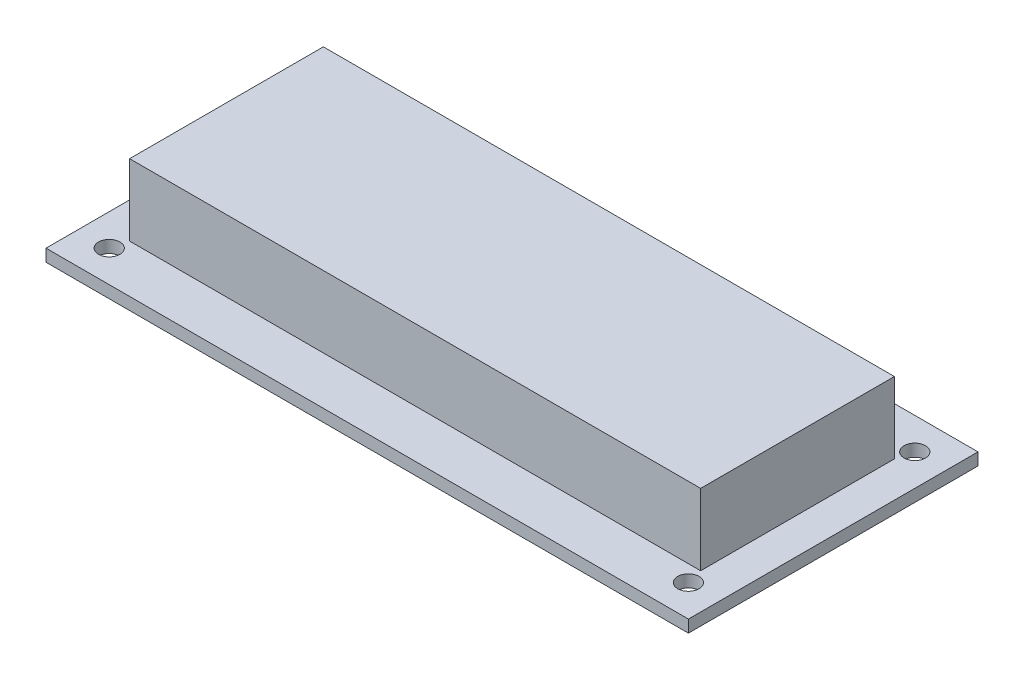
ISO-10303-21;
HEADER;
FILE_DESCRIPTION(('STEP AP214'),'2;1');
FILE_NAME('part.step','',(''),(''),'','','');
FILE_SCHEMA(('AUTOMOTIVE_DESIGN { 1 0 10303 214 1 1 1 1 }'));
ENDSEC;
DATA;
#1=APPLICATION_CONTEXT('core data for automotive mechanical design processes');
#2=APPLICATION_PROTOCOL_DEFINITION('international standard','automotive_design',2000,#1);
#3=PRODUCT_CONTEXT('',#1,'mechanical');
#4=PRODUCT('Part','Part','',(#3));
#5=PRODUCT_RELATED_PRODUCT_CATEGORY('part','',(#4));
#6=PRODUCT_DEFINITION_FORMATION('','',#4);
#7=PRODUCT_DEFINITION_CONTEXT('part definition',#1,'design');
#8=PRODUCT_DEFINITION('design','',#6,#7);
#9=PRODUCT_DEFINITION_SHAPE('','',#8);
#10=(LENGTH_UNIT() NAMED_UNIT(*) SI_UNIT(.MILLI.,.METRE.));
#11=(NAMED_UNIT(*) PLANE_ANGLE_UNIT() SI_UNIT($,.RADIAN.));
#12=(NAMED_UNIT(*) SI_UNIT($,.STERADIAN.) SOLID_ANGLE_UNIT());
#13=UNCERTAINTY_MEASURE_WITH_UNIT(LENGTH_MEASURE(1.E-05),#10,'distance_accuracy_value','');
#14=(GEOMETRIC_REPRESENTATION_CONTEXT(3) GLOBAL_UNCERTAINTY_ASSIGNED_CONTEXT((#13)) GLOBAL_UNIT_ASSIGNED_CONTEXT((#10,
#11,#12)) REPRESENTATION_CONTEXT('',''));
#15=CARTESIAN_POINT('',(0.,0.,0.));
#16=DIRECTION('',(0.,0.,1.));
#17=DIRECTION('',(1.,0.,0.));
#18=AXIS2_PLACEMENT_3D('',#15,#16,#17);
#19=CARTESIAN_POINT('',(0.,1.524,0.));
#20=DIRECTION('',(0.,1.,0.));
#21=DIRECTION('',(0.,0.,1.));
#22=AXIS2_PLACEMENT_3D('',#19,#20,#21);
#23=PLANE('',#22);
#24=CARTESIAN_POINT('',(-36.068,1.524,14.097));
#25=DIRECTION('',(0.,1.,0.));
#26=DIRECTION('',(0.,0.,1.));
#27=AXIS2_PLACEMENT_3D('',#24,#25,#26);
#28=CIRCLE('',#27,1.3335);
#29=CARTESIAN_POINT('',(-36.068,1.524,15.4305));
#30=VERTEX_POINT('',#29);
#31=EDGE_CURVE('E186',#30,#30,#28,.T.);
#32=ORIENTED_EDGE('',*,*,#31,.F.);
#33=EDGE_LOOP('',(#32));
#34=FACE_BOUND('',#33,.T.);
#35=CARTESIAN_POINT('',(36.068,1.524,14.097));
#36=DIRECTION('',(0.,1.,0.));
#37=DIRECTION('',(0.,0.,1.));
#38=AXIS2_PLACEMENT_3D('',#35,#36,#37);
#39=CIRCLE('',#38,1.3335);
#40=CARTESIAN_POINT('',(36.068,1.524,15.4305));
#41=VERTEX_POINT('',#40);
#42=EDGE_CURVE('E195',#41,#41,#39,.T.);
#43=ORIENTED_EDGE('',*,*,#42,.F.);
#44=EDGE_LOOP('',(#43));
#45=FACE_BOUND('',#44,.T.);
#46=CARTESIAN_POINT('',(36.068,1.524,-14.097));
#47=DIRECTION('',(0.,1.,0.));
#48=DIRECTION('',(0.,0.,1.));
#49=AXIS2_PLACEMENT_3D('',#46,#47,#48);
#50=CIRCLE('',#49,1.3335);
#51=CARTESIAN_POINT('',(36.068,1.524,-12.7635));
#52=VERTEX_POINT('',#51);
#53=EDGE_CURVE('E187',#52,#52,#50,.T.);
#54=ORIENTED_EDGE('',*,*,#53,.F.);
#55=EDGE_LOOP('',(#54));
#56=FACE_BOUND('',#55,.T.);
#57=CARTESIAN_POINT('',(-36.068,1.524,-14.097));
#58=DIRECTION('',(0.,1.,0.));
#59=DIRECTION('',(0.,0.,1.));
#60=AXIS2_PLACEMENT_3D('',#57,#58,#59);
#61=CIRCLE('',#60,1.3335);
#62=CARTESIAN_POINT('',(-36.068,1.524,-12.7635));
#63=VERTEX_POINT('',#62);
#64=EDGE_CURVE('E194',#63,#63,#61,.T.);
#65=ORIENTED_EDGE('',*,*,#64,.F.);
#66=EDGE_LOOP('',(#65));
#67=FACE_BOUND('',#66,.T.);
#68=DIRECTION('',(0.,0.,-1.));
#69=VECTOR('',#68,1.);
#70=CARTESIAN_POINT('',(40.005,1.524,-18.034));
#71=LINE('',#70,#69);
#72=CARTESIAN_POINT('',(40.005,1.524,18.034));
#73=VERTEX_POINT('',#72);
#74=CARTESIAN_POINT('',(40.005,1.524,-18.034));
#75=VERTEX_POINT('',#74);
#76=EDGE_CURVE('E211',#73,#75,#71,.T.);
#77=ORIENTED_EDGE('',*,*,#76,.T.);
#78=DIRECTION('',(-1.,0.,0.));
#79=VECTOR('',#78,1.);
#80=CARTESIAN_POINT('',(-40.005,1.524,-18.034));
#81=LINE('',#80,#79);
#82=CARTESIAN_POINT('',(-40.005,1.524,-18.034));
#83=VERTEX_POINT('',#82);
#84=EDGE_CURVE('E214',#75,#83,#81,.T.);
#85=ORIENTED_EDGE('',*,*,#84,.T.);
#86=DIRECTION('',(0.,0.,1.));
#87=VECTOR('',#86,1.);
#88=CARTESIAN_POINT('',(-40.005,1.524,-18.034));
#89=LINE('',#88,#87);
#90=CARTESIAN_POINT('',(-40.005,1.524,18.034));
#91=VERTEX_POINT('',#90);
#92=EDGE_CURVE('E217',#83,#91,#89,.T.);
#93=ORIENTED_EDGE('',*,*,#92,.T.);
#94=DIRECTION('',(1.,0.,0.));
#95=VECTOR('',#94,1.);
#96=CARTESIAN_POINT('',(-40.005,1.524,18.034));
#97=LINE('',#96,#95);
#98=EDGE_CURVE('E219',#91,#73,#97,.T.);
#99=ORIENTED_EDGE('',*,*,#98,.T.);
#100=EDGE_LOOP('',(#77,#85,#93,#99));
#101=FACE_BOUND('',#100,.T.);
#102=DIRECTION('',(0.,0.,1.));
#103=VECTOR('',#102,1.);
#104=CARTESIAN_POINT('',(-38.481,1.524,-9.0678));
#105=LINE('',#104,#103);
#106=CARTESIAN_POINT('',(-38.481,1.524,-9.0678));
#107=VERTEX_POINT('',#106);
#108=CARTESIAN_POINT('',(-38.481,1.524,9.017));
#109=VERTEX_POINT('',#108);
#110=EDGE_CURVE('E47',#107,#109,#105,.T.);
#111=ORIENTED_EDGE('',*,*,#110,.F.);
#112=DIRECTION('',(-1.,0.,0.));
#113=VECTOR('',#112,1.);
#114=CARTESIAN_POINT('',(-35.56,1.524,-9.0678));
#115=LINE('',#114,#113);
#116=CARTESIAN_POINT('',(-35.56,1.524,-9.0678));
#117=VERTEX_POINT('',#116);
#118=EDGE_CURVE('E151',#117,#107,#115,.T.);
#119=ORIENTED_EDGE('',*,*,#118,.F.);
#120=DIRECTION('',(0.,0.,1.));
#121=VECTOR('',#120,1.);
#122=CARTESIAN_POINT('',(-35.56,1.524,-12.065));
#123=LINE('',#122,#121);
#124=CARTESIAN_POINT('',(-35.56,1.524,-12.065));
#125=VERTEX_POINT('',#124);
#126=EDGE_CURVE('E128',#125,#117,#123,.T.);
#127=ORIENTED_EDGE('',*,*,#126,.F.);
#128=DIRECTION('',(-1.,0.,0.));
#129=VECTOR('',#128,1.);
#130=CARTESIAN_POINT('',(-35.56,1.524,-12.065));
#131=LINE('',#130,#129);
#132=CARTESIAN_POINT('',(35.56,1.524,-12.065));
#133=VERTEX_POINT('',#132);
#134=EDGE_CURVE('E172',#133,#125,#131,.T.);
#135=ORIENTED_EDGE('',*,*,#134,.F.);
#136=DIRECTION('',(0.,0.,-1.));
#137=VECTOR('',#136,1.);
#138=CARTESIAN_POINT('',(35.56,1.524,-12.065));
#139=LINE('',#138,#137);
#140=CARTESIAN_POINT('',(35.56,1.524,12.065));
#141=VERTEX_POINT('',#140);
#142=EDGE_CURVE('E130',#141,#133,#139,.T.);
#143=ORIENTED_EDGE('',*,*,#142,.F.);
#144=DIRECTION('',(1.,0.,0.));
#145=VECTOR('',#144,1.);
#146=CARTESIAN_POINT('',(-35.56,1.524,12.065));
#147=LINE('',#146,#145);
#148=CARTESIAN_POINT('',(-35.56,1.524,12.065));
#149=VERTEX_POINT('',#148);
#150=EDGE_CURVE('E163',#149,#141,#147,.T.);
#151=ORIENTED_EDGE('',*,*,#150,.F.);
#152=CARTESIAN_POINT('',(-35.56,1.524,9.01699999999999));
#153=VERTEX_POINT('',#152);
#154=EDGE_CURVE('E174',#153,#149,#123,.T.);
#155=ORIENTED_EDGE('',*,*,#154,.F.);
#156=DIRECTION('',(1.,0.,0.));
#157=VECTOR('',#156,1.);
#158=CARTESIAN_POINT('',(-35.56,1.524,9.017));
#159=LINE('',#158,#157);
#160=EDGE_CURVE('E52',#109,#153,#159,.T.);
#161=ORIENTED_EDGE('',*,*,#160,.F.);
#162=EDGE_LOOP('',(#111,#119,#127,#135,#143,#151,#155,#161));
#163=FACE_BOUND('',#162,.T.);
#164=ADVANCED_FACE('F32',(#34,#45,#56,#67,#101,#163),#23,.T.);
#165=CARTESIAN_POINT('',(-35.56,10.414,-12.065));
#166=DIRECTION('',(1.,0.,0.));
#167=DIRECTION('',(0.,0.,-1.));
#168=AXIS2_PLACEMENT_3D('',#165,#166,#167);
#169=PLANE('',#168);
#170=DIRECTION('',(0.,-1.,0.));
#171=VECTOR('',#170,1.);
#172=CARTESIAN_POINT('',(-35.56,4.699,-9.0678));
#173=LINE('',#172,#171);
#174=CARTESIAN_POINT('',(-35.56,4.699,-9.0678));
#175=VERTEX_POINT('',#174);
#176=EDGE_CURVE('E120',#175,#117,#173,.T.);
#177=ORIENTED_EDGE('',*,*,#176,.F.);
#178=DIRECTION('',(0.,0.,-1.));
#179=VECTOR('',#178,1.);
#180=CARTESIAN_POINT('',(-35.56,4.699,-9.0678));
#181=LINE('',#180,#179);
#182=CARTESIAN_POINT('',(-35.56,4.699,9.017));
#183=VERTEX_POINT('',#182);
#184=EDGE_CURVE('E124',#183,#175,#181,.T.);
#185=ORIENTED_EDGE('',*,*,#184,.F.);
#186=DIRECTION('',(0.,-1.,0.));
#187=VECTOR('',#186,1.);
#188=CARTESIAN_POINT('',(-35.56,4.699,9.017));
#189=LINE('',#188,#187);
#190=EDGE_CURVE('E150',#183,#153,#189,.T.);
#191=ORIENTED_EDGE('',*,*,#190,.T.);
#192=ORIENTED_EDGE('',*,*,#154,.T.);
#193=DIRECTION('',(0.,-1.,0.));
#194=VECTOR('',#193,1.);
#195=CARTESIAN_POINT('',(-35.56,10.414,12.065));
#196=LINE('',#195,#194);
#197=CARTESIAN_POINT('',(-35.56,10.414,12.065));
#198=VERTEX_POINT('',#197);
#199=EDGE_CURVE('E179',#198,#149,#196,.T.);
#200=ORIENTED_EDGE('',*,*,#199,.F.);
#201=DIRECTION('',(0.,0.,1.));
#202=VECTOR('',#201,1.);
#203=CARTESIAN_POINT('',(-35.56,10.414,-12.065));
#204=LINE('',#203,#202);
#205=CARTESIAN_POINT('',(-35.56,10.414,-12.065));
#206=VERTEX_POINT('',#205);
#207=EDGE_CURVE('E165',#206,#198,#204,.T.);
#208=ORIENTED_EDGE('',*,*,#207,.F.);
#209=DIRECTION('',(0.,-1.,0.));
#210=VECTOR('',#209,1.);
#211=CARTESIAN_POINT('',(-35.56,10.414,-12.065));
#212=LINE('',#211,#210);
#213=EDGE_CURVE('E182',#206,#125,#212,.T.);
#214=ORIENTED_EDGE('',*,*,#213,.T.);
#215=ORIENTED_EDGE('',*,*,#126,.T.);
#216=EDGE_LOOP('',(#177,#185,#191,#192,#200,#208,#214,#215));
#217=FACE_BOUND('',#216,.T.);
#218=ADVANCED_FACE('F122',(#217),#169,.F.);
#219=CARTESIAN_POINT('',(40.005,1.524,-18.034));
#220=DIRECTION('',(-1.,0.,0.));
#221=DIRECTION('',(0.,0.,1.));
#222=AXIS2_PLACEMENT_3D('',#219,#220,#221);
#223=PLANE('',#222);
#224=DIRECTION('',(0.,0.,-1.));
#225=VECTOR('',#224,1.);
#226=CARTESIAN_POINT('',(40.005,0.,-18.034));
#227=LINE('',#226,#225);
#228=CARTESIAN_POINT('',(40.005,0.,18.034));
#229=VERTEX_POINT('',#228);
#230=CARTESIAN_POINT('',(40.005,0.,-18.034));
#231=VERTEX_POINT('',#230);
#232=EDGE_CURVE('E210',#229,#231,#227,.T.);
#233=ORIENTED_EDGE('',*,*,#232,.T.);
#234=DIRECTION('',(0.,-1.,0.));
#235=VECTOR('',#234,1.);
#236=CARTESIAN_POINT('',(40.005,1.524,-18.034));
#237=LINE('',#236,#235);
#238=EDGE_CURVE('E11',#75,#231,#237,.T.);
#239=ORIENTED_EDGE('',*,*,#238,.F.);
#240=ORIENTED_EDGE('',*,*,#76,.F.);
#241=DIRECTION('',(0.,-1.,0.));
#242=VECTOR('',#241,1.);
#243=CARTESIAN_POINT('',(40.005,1.524,18.034));
#244=LINE('',#243,#242);
#245=EDGE_CURVE('E221',#73,#229,#244,.T.);
#246=ORIENTED_EDGE('',*,*,#245,.T.);
#247=EDGE_LOOP('',(#233,#239,#240,#246));
#248=FACE_BOUND('',#247,.T.);
#249=ADVANCED_FACE('F34',(#248),#223,.F.);
#250=CARTESIAN_POINT('',(-40.005,1.524,-18.034));
#251=DIRECTION('',(0.,0.,1.));
#252=DIRECTION('',(1.,0.,0.));
#253=AXIS2_PLACEMENT_3D('',#250,#251,#252);
#254=PLANE('',#253);
#255=DIRECTION('',(-1.,0.,0.));
#256=VECTOR('',#255,1.);
#257=CARTESIAN_POINT('',(-40.005,0.,-18.034));
#258=LINE('',#257,#256);
#259=CARTESIAN_POINT('',(-40.005,0.,-18.034));
#260=VERTEX_POINT('',#259);
#261=EDGE_CURVE('E224',#231,#260,#258,.T.);
#262=ORIENTED_EDGE('',*,*,#261,.T.);
#263=DIRECTION('',(0.,-1.,0.));
#264=VECTOR('',#263,1.);
#265=CARTESIAN_POINT('',(-40.005,1.524,-18.034));
#266=LINE('',#265,#264);
#267=EDGE_CURVE('E40',#83,#260,#266,.T.);
#268=ORIENTED_EDGE('',*,*,#267,.F.);
#269=ORIENTED_EDGE('',*,*,#84,.F.);
#270=ORIENTED_EDGE('',*,*,#238,.T.);
#271=EDGE_LOOP('',(#262,#268,#269,#270));
#272=FACE_BOUND('',#271,.T.);
#273=ADVANCED_FACE('F253',(#272),#254,.F.);
#274=CARTESIAN_POINT('',(-40.005,1.524,-18.034));
#275=DIRECTION('',(1.,0.,0.));
#276=DIRECTION('',(0.,0.,-1.));
#277=AXIS2_PLACEMENT_3D('',#274,#275,#276);
#278=PLANE('',#277);
#279=DIRECTION('',(0.,0.,1.));
#280=VECTOR('',#279,1.);
#281=CARTESIAN_POINT('',(-40.005,0.,-18.034));
#282=LINE('',#281,#280);
#283=CARTESIAN_POINT('',(-40.005,0.,18.034));
#284=VERTEX_POINT('',#283);
#285=EDGE_CURVE('E226',#260,#284,#282,.T.);
#286=ORIENTED_EDGE('',*,*,#285,.T.);
#287=DIRECTION('',(0.,-1.,0.));
#288=VECTOR('',#287,1.);
#289=CARTESIAN_POINT('',(-40.005,1.524,18.034));
#290=LINE('',#289,#288);
#291=EDGE_CURVE('E231',#91,#284,#290,.T.);
#292=ORIENTED_EDGE('',*,*,#291,.F.);
#293=ORIENTED_EDGE('',*,*,#92,.F.);
#294=ORIENTED_EDGE('',*,*,#267,.T.);
#295=EDGE_LOOP('',(#286,#292,#293,#294));
#296=FACE_BOUND('',#295,.T.);
#297=ADVANCED_FACE('F238',(#296),#278,.F.);
#298=CARTESIAN_POINT('',(-40.005,1.524,18.034));
#299=DIRECTION('',(0.,0.,-1.));
#300=DIRECTION('',(-1.,0.,0.));
#301=AXIS2_PLACEMENT_3D('',#298,#299,#300);
#302=PLANE('',#301);
#303=DIRECTION('',(1.,0.,0.));
#304=VECTOR('',#303,1.);
#305=CARTESIAN_POINT('',(-40.005,0.,18.034));
#306=LINE('',#305,#304);
#307=EDGE_CURVE('E215',#284,#229,#306,.T.);
#308=ORIENTED_EDGE('',*,*,#307,.T.);
#309=ORIENTED_EDGE('',*,*,#245,.F.);
#310=ORIENTED_EDGE('',*,*,#98,.F.);
#311=ORIENTED_EDGE('',*,*,#291,.T.);
#312=EDGE_LOOP('',(#308,#309,#310,#311));
#313=FACE_BOUND('',#312,.T.);
#314=ADVANCED_FACE('F247',(#313),#302,.F.);
#315=CARTESIAN_POINT('',(0.,0.,0.));
#316=DIRECTION('',(0.,1.,0.));
#317=DIRECTION('',(0.,0.,1.));
#318=AXIS2_PLACEMENT_3D('',#315,#316,#317);
#319=PLANE('',#318);
#320=CARTESIAN_POINT('',(-36.068,0.,14.097));
#321=DIRECTION('',(0.,1.,0.));
#322=DIRECTION('',(0.,0.,1.));
#323=AXIS2_PLACEMENT_3D('',#320,#321,#322);
#324=CIRCLE('',#323,1.3335);
#325=CARTESIAN_POINT('',(-36.068,0.,15.4305));
#326=VERTEX_POINT('',#325);
#327=EDGE_CURVE('E198',#326,#326,#324,.F.);
#328=ORIENTED_EDGE('',*,*,#327,.F.);
#329=EDGE_LOOP('',(#328));
#330=FACE_BOUND('',#329,.T.);
#331=CARTESIAN_POINT('',(36.068,0.,14.097));
#332=DIRECTION('',(0.,1.,0.));
#333=DIRECTION('',(0.,0.,1.));
#334=AXIS2_PLACEMENT_3D('',#331,#332,#333);
#335=CIRCLE('',#334,1.3335);
#336=CARTESIAN_POINT('',(36.068,0.,15.4305));
#337=VERTEX_POINT('',#336);
#338=EDGE_CURVE('E191',#337,#337,#335,.F.);
#339=ORIENTED_EDGE('',*,*,#338,.F.);
#340=EDGE_LOOP('',(#339));
#341=FACE_BOUND('',#340,.T.);
#342=CARTESIAN_POINT('',(36.068,0.,-14.097));
#343=DIRECTION('',(0.,1.,0.));
#344=DIRECTION('',(0.,0.,1.));
#345=AXIS2_PLACEMENT_3D('',#342,#343,#344);
#346=CIRCLE('',#345,1.3335);
#347=CARTESIAN_POINT('',(36.068,0.,-12.7635));
#348=VERTEX_POINT('',#347);
#349=EDGE_CURVE('E190',#348,#348,#346,.F.);
#350=ORIENTED_EDGE('',*,*,#349,.F.);
#351=EDGE_LOOP('',(#350));
#352=FACE_BOUND('',#351,.T.);
#353=CARTESIAN_POINT('',(-36.068,0.,-14.097));
#354=DIRECTION('',(0.,1.,0.));
#355=DIRECTION('',(0.,0.,1.));
#356=AXIS2_PLACEMENT_3D('',#353,#354,#355);
#357=CIRCLE('',#356,1.3335);
#358=CARTESIAN_POINT('',(-36.068,0.,-12.7635));
#359=VERTEX_POINT('',#358);
#360=EDGE_CURVE('E207',#359,#359,#357,.F.);
#361=ORIENTED_EDGE('',*,*,#360,.F.);
#362=EDGE_LOOP('',(#361));
#363=FACE_BOUND('',#362,.T.);
#364=ORIENTED_EDGE('',*,*,#232,.F.);
#365=ORIENTED_EDGE('',*,*,#307,.F.);
#366=ORIENTED_EDGE('',*,*,#285,.F.);
#367=ORIENTED_EDGE('',*,*,#261,.F.);
#368=EDGE_LOOP('',(#364,#365,#366,#367));
#369=FACE_BOUND('',#368,.T.);
#370=ADVANCED_FACE('F244',(#330,#341,#352,#363,#369),#319,.F.);
#371=CARTESIAN_POINT('',(-36.068,-0.000999999999999916,-14.097));
#372=DIRECTION('',(0.,1.,0.));
#373=DIRECTION('',(0.,0.,1.));
#374=AXIS2_PLACEMENT_3D('',#371,#372,#373);
#375=CYLINDRICAL_SURFACE('',#374,1.3335);
#376=ORIENTED_EDGE('',*,*,#64,.T.);
#377=EDGE_LOOP('',(#376));
#378=FACE_BOUND('',#377,.T.);
#379=ORIENTED_EDGE('',*,*,#360,.T.);
#380=EDGE_LOOP('',(#379));
#381=FACE_BOUND('',#380,.T.);
#382=ADVANCED_FACE('F271',(#378,#381),#375,.F.);
#383=CARTESIAN_POINT('',(36.068,-0.000999999999999916,-14.097));
#384=DIRECTION('',(0.,1.,0.));
#385=DIRECTION('',(0.,0.,1.));
#386=AXIS2_PLACEMENT_3D('',#383,#384,#385);
#387=CYLINDRICAL_SURFACE('',#386,1.3335);
#388=ORIENTED_EDGE('',*,*,#53,.T.);
#389=EDGE_LOOP('',(#388));
#390=FACE_BOUND('',#389,.T.);
#391=ORIENTED_EDGE('',*,*,#349,.T.);
#392=EDGE_LOOP('',(#391));
#393=FACE_BOUND('',#392,.T.);
#394=ADVANCED_FACE('F291',(#390,#393),#387,.F.);
#395=CARTESIAN_POINT('',(36.068,-0.000999999999999916,14.097));
#396=DIRECTION('',(0.,1.,0.));
#397=DIRECTION('',(0.,0.,1.));
#398=AXIS2_PLACEMENT_3D('',#395,#396,#397);
#399=CYLINDRICAL_SURFACE('',#398,1.3335);
#400=ORIENTED_EDGE('',*,*,#42,.T.);
#401=EDGE_LOOP('',(#400));
#402=FACE_BOUND('',#401,.T.);
#403=ORIENTED_EDGE('',*,*,#338,.T.);
#404=EDGE_LOOP('',(#403));
#405=FACE_BOUND('',#404,.T.);
#406=ADVANCED_FACE('F298',(#402,#405),#399,.F.);
#407=CARTESIAN_POINT('',(-36.068,-0.000999999999999916,14.097));
#408=DIRECTION('',(0.,1.,0.));
#409=DIRECTION('',(0.,0.,1.));
#410=AXIS2_PLACEMENT_3D('',#407,#408,#409);
#411=CYLINDRICAL_SURFACE('',#410,1.3335);
#412=ORIENTED_EDGE('',*,*,#31,.T.);
#413=EDGE_LOOP('',(#412));
#414=FACE_BOUND('',#413,.T.);
#415=ORIENTED_EDGE('',*,*,#327,.T.);
#416=EDGE_LOOP('',(#415));
#417=FACE_BOUND('',#416,.T.);
#418=ADVANCED_FACE('F306',(#414,#417),#411,.F.);
#419=CARTESIAN_POINT('',(35.56,10.414,-12.065));
#420=DIRECTION('',(-1.,0.,0.));
#421=DIRECTION('',(0.,0.,1.));
#422=AXIS2_PLACEMENT_3D('',#419,#420,#421);
#423=PLANE('',#422);
#424=ORIENTED_EDGE('',*,*,#142,.T.);
#425=DIRECTION('',(0.,-1.,0.));
#426=VECTOR('',#425,1.);
#427=CARTESIAN_POINT('',(35.56,10.414,-12.065));
#428=LINE('',#427,#426);
#429=CARTESIAN_POINT('',(35.56,10.414,-12.065));
#430=VERTEX_POINT('',#429);
#431=EDGE_CURVE('E184',#430,#133,#428,.T.);
#432=ORIENTED_EDGE('',*,*,#431,.F.);
#433=DIRECTION('',(0.,0.,-1.));
#434=VECTOR('',#433,1.);
#435=CARTESIAN_POINT('',(35.56,10.414,-12.065));
#436=LINE('',#435,#434);
#437=CARTESIAN_POINT('',(35.56,10.414,12.065));
#438=VERTEX_POINT('',#437);
#439=EDGE_CURVE('E159',#438,#430,#436,.T.);
#440=ORIENTED_EDGE('',*,*,#439,.F.);
#441=DIRECTION('',(0.,-1.,0.));
#442=VECTOR('',#441,1.);
#443=CARTESIAN_POINT('',(35.56,10.414,12.065));
#444=LINE('',#443,#442);
#445=EDGE_CURVE('E169',#438,#141,#444,.T.);
#446=ORIENTED_EDGE('',*,*,#445,.T.);
#447=EDGE_LOOP('',(#424,#432,#440,#446));
#448=FACE_BOUND('',#447,.T.);
#449=ADVANCED_FACE('F314',(#448),#423,.F.);
#450=CARTESIAN_POINT('',(-35.56,10.414,-12.065));
#451=DIRECTION('',(0.,0.,1.));
#452=DIRECTION('',(1.,0.,0.));
#453=AXIS2_PLACEMENT_3D('',#450,#451,#452);
#454=PLANE('',#453);
#455=ORIENTED_EDGE('',*,*,#134,.T.);
#456=ORIENTED_EDGE('',*,*,#213,.F.);
#457=DIRECTION('',(-1.,0.,0.));
#458=VECTOR('',#457,1.);
#459=CARTESIAN_POINT('',(-35.56,10.414,-12.065));
#460=LINE('',#459,#458);
#461=EDGE_CURVE('E162',#430,#206,#460,.T.);
#462=ORIENTED_EDGE('',*,*,#461,.F.);
#463=ORIENTED_EDGE('',*,*,#431,.T.);
#464=EDGE_LOOP('',(#455,#456,#462,#463));
#465=FACE_BOUND('',#464,.T.);
#466=ADVANCED_FACE('F321',(#465),#454,.F.);
#467=CARTESIAN_POINT('',(-35.56,10.414,12.065));
#468=DIRECTION('',(0.,0.,-1.));
#469=DIRECTION('',(-1.,0.,0.));
#470=AXIS2_PLACEMENT_3D('',#467,#468,#469);
#471=PLANE('',#470);
#472=ORIENTED_EDGE('',*,*,#150,.T.);
#473=ORIENTED_EDGE('',*,*,#445,.F.);
#474=DIRECTION('',(1.,0.,0.));
#475=VECTOR('',#474,1.);
#476=CARTESIAN_POINT('',(-35.56,10.414,12.065));
#477=LINE('',#476,#475);
#478=EDGE_CURVE('E167',#198,#438,#477,.T.);
#479=ORIENTED_EDGE('',*,*,#478,.F.);
#480=ORIENTED_EDGE('',*,*,#199,.T.);
#481=EDGE_LOOP('',(#472,#473,#479,#480));
#482=FACE_BOUND('',#481,.T.);
#483=ADVANCED_FACE('F329',(#482),#471,.F.);
#484=CARTESIAN_POINT('',(0.,10.414,0.));
#485=DIRECTION('',(0.,1.,0.));
#486=DIRECTION('',(0.,0.,1.));
#487=AXIS2_PLACEMENT_3D('',#484,#485,#486);
#488=PLANE('',#487);
#489=ORIENTED_EDGE('',*,*,#439,.T.);
#490=ORIENTED_EDGE('',*,*,#461,.T.);
#491=ORIENTED_EDGE('',*,*,#207,.T.);
#492=ORIENTED_EDGE('',*,*,#478,.T.);
#493=EDGE_LOOP('',(#489,#490,#491,#492));
#494=FACE_BOUND('',#493,.T.);
#495=ADVANCED_FACE('F337',(#494),#488,.T.);
#496=CARTESIAN_POINT('',(-35.56,4.699,-9.0678));
#497=DIRECTION('',(0.,0.,1.));
#498=DIRECTION('',(1.,0.,0.));
#499=AXIS2_PLACEMENT_3D('',#496,#497,#498);
#500=PLANE('',#499);
#501=ORIENTED_EDGE('',*,*,#118,.T.);
#502=DIRECTION('',(0.,-1.,0.));
#503=VECTOR('',#502,1.);
#504=CARTESIAN_POINT('',(-38.481,4.699,-9.0678));
#505=LINE('',#504,#503);
#506=CARTESIAN_POINT('',(-38.481,4.699,-9.0678));
#507=VERTEX_POINT('',#506);
#508=EDGE_CURVE('E131',#507,#107,#505,.T.);
#509=ORIENTED_EDGE('',*,*,#508,.F.);
#510=DIRECTION('',(-1.,0.,0.));
#511=VECTOR('',#510,1.);
#512=CARTESIAN_POINT('',(-35.56,4.699,-9.0678));
#513=LINE('',#512,#511);
#514=EDGE_CURVE('E134',#175,#507,#513,.T.);
#515=ORIENTED_EDGE('',*,*,#514,.F.);
#516=ORIENTED_EDGE('',*,*,#176,.T.);
#517=EDGE_LOOP('',(#501,#509,#515,#516));
#518=FACE_BOUND('',#517,.T.);
#519=ADVANCED_FACE('F135',(#518),#500,.F.);
#520=CARTESIAN_POINT('',(-38.481,4.699,-9.0678));
#521=DIRECTION('',(1.,0.,0.));
#522=DIRECTION('',(0.,0.,-1.));
#523=AXIS2_PLACEMENT_3D('',#520,#521,#522);
#524=PLANE('',#523);
#525=ORIENTED_EDGE('',*,*,#110,.T.);
#526=DIRECTION('',(0.,-1.,0.));
#527=VECTOR('',#526,1.);
#528=CARTESIAN_POINT('',(-38.481,4.699,9.017));
#529=LINE('',#528,#527);
#530=CARTESIAN_POINT('',(-38.481,4.699,9.017));
#531=VERTEX_POINT('',#530);
#532=EDGE_CURVE('E155',#531,#109,#529,.T.);
#533=ORIENTED_EDGE('',*,*,#532,.F.);
#534=DIRECTION('',(0.,0.,1.));
#535=VECTOR('',#534,1.);
#536=CARTESIAN_POINT('',(-38.481,4.699,-9.0678));
#537=LINE('',#536,#535);
#538=EDGE_CURVE('E139',#507,#531,#537,.T.);
#539=ORIENTED_EDGE('',*,*,#538,.F.);
#540=ORIENTED_EDGE('',*,*,#508,.T.);
#541=EDGE_LOOP('',(#525,#533,#539,#540));
#542=FACE_BOUND('',#541,.T.);
#543=ADVANCED_FACE('F352',(#542),#524,.F.);
#544=CARTESIAN_POINT('',(-35.56,4.699,9.017));
#545=DIRECTION('',(0.,0.,-1.));
#546=DIRECTION('',(-1.,0.,0.));
#547=AXIS2_PLACEMENT_3D('',#544,#545,#546);
#548=PLANE('',#547);
#549=ORIENTED_EDGE('',*,*,#160,.T.);
#550=ORIENTED_EDGE('',*,*,#190,.F.);
#551=DIRECTION('',(1.,0.,0.));
#552=VECTOR('',#551,1.);
#553=CARTESIAN_POINT('',(-35.56,4.699,9.017));
#554=LINE('',#553,#552);
#555=EDGE_CURVE('E143',#531,#183,#554,.T.);
#556=ORIENTED_EDGE('',*,*,#555,.F.);
#557=ORIENTED_EDGE('',*,*,#532,.T.);
#558=EDGE_LOOP('',(#549,#550,#556,#557));
#559=FACE_BOUND('',#558,.T.);
#560=ADVANCED_FACE('F360',(#559),#548,.F.);
#561=CARTESIAN_POINT('',(0.,4.699,0.));
#562=DIRECTION('',(0.,-1.,0.));
#563=DIRECTION('',(0.,0.,-1.));
#564=AXIS2_PLACEMENT_3D('',#561,#562,#563);
#565=PLANE('',#564);
#566=ORIENTED_EDGE('',*,*,#184,.T.);
#567=ORIENTED_EDGE('',*,*,#514,.T.);
#568=ORIENTED_EDGE('',*,*,#538,.T.);
#569=ORIENTED_EDGE('',*,*,#555,.T.);
#570=EDGE_LOOP('',(#566,#567,#568,#569));
#571=FACE_BOUND('',#570,.T.);
#572=ADVANCED_FACE('F141',(#571),#565,.F.);
#573=CLOSED_SHELL('',(#164,#218,#249,#273,#297,#314,#370,#382,#394,#406,#418,#449,#466,#483,
#495,#519,#543,#560,#572));
#574=MANIFOLD_SOLID_BREP('B2',#573);
#575=ADVANCED_BREP_SHAPE_REPRESENTATION('',(#18,#574),#14);
#576=SHAPE_DEFINITION_REPRESENTATION(#9,#575);
ENDSEC;
END-ISO-10303-21;
